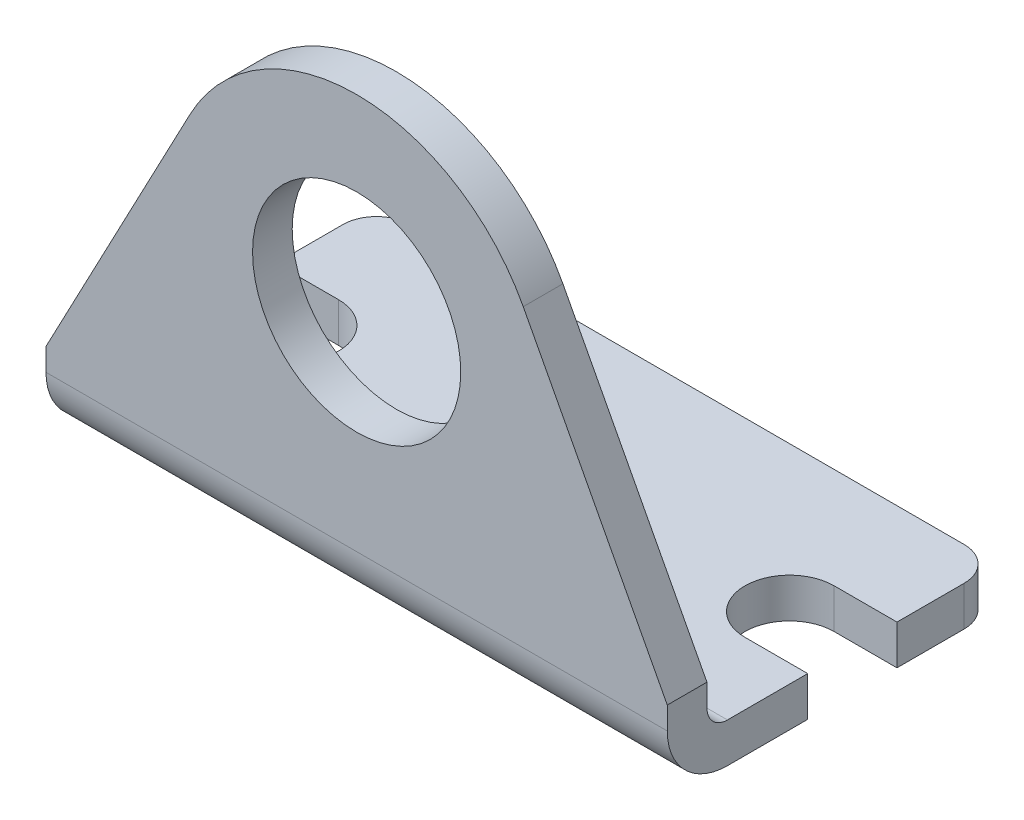
ISO-10303-21;
HEADER;
FILE_DESCRIPTION(('STEP AP214'),'2;1');
FILE_NAME('part.step','',(''),(''),'','','');
FILE_SCHEMA(('AUTOMOTIVE_DESIGN { 1 0 10303 214 1 1 1 1 }'));
ENDSEC;
DATA;
#1=APPLICATION_CONTEXT('core data for automotive mechanical design processes');
#2=APPLICATION_PROTOCOL_DEFINITION('international standard','automotive_design',2000,#1);
#3=PRODUCT_CONTEXT('',#1,'mechanical');
#4=PRODUCT('Part','Part','',(#3));
#5=PRODUCT_RELATED_PRODUCT_CATEGORY('part','',(#4));
#6=PRODUCT_DEFINITION_FORMATION('','',#4);
#7=PRODUCT_DEFINITION_CONTEXT('part definition',#1,'design');
#8=PRODUCT_DEFINITION('design','',#6,#7);
#9=PRODUCT_DEFINITION_SHAPE('','',#8);
#10=(LENGTH_UNIT() NAMED_UNIT(*) SI_UNIT(.MILLI.,.METRE.));
#11=(NAMED_UNIT(*) PLANE_ANGLE_UNIT() SI_UNIT($,.RADIAN.));
#12=(NAMED_UNIT(*) SI_UNIT($,.STERADIAN.) SOLID_ANGLE_UNIT());
#13=UNCERTAINTY_MEASURE_WITH_UNIT(LENGTH_MEASURE(1.E-05),#10,'distance_accuracy_value','');
#14=(GEOMETRIC_REPRESENTATION_CONTEXT(3) GLOBAL_UNCERTAINTY_ASSIGNED_CONTEXT((#13)) GLOBAL_UNIT_ASSIGNED_CONTEXT((#10,
#11,#12)) REPRESENTATION_CONTEXT('',''));
#15=CARTESIAN_POINT('',(0.,0.,0.));
#16=DIRECTION('',(0.,0.,1.));
#17=DIRECTION('',(1.,0.,0.));
#18=AXIS2_PLACEMENT_3D('',#15,#16,#17);
#19=CARTESIAN_POINT('',(-23.876,0.,-3.048));
#20=DIRECTION('',(-1.,0.,0.));
#21=DIRECTION('',(0.,0.,1.));
#22=AXIS2_PLACEMENT_3D('',#19,#20,#21);
#23=PLANE('',#22);
#24=DIRECTION('',(0.,0.,1.));
#25=VECTOR('',#24,1.);
#26=CARTESIAN_POINT('',(-23.876,0.,-3.048));
#27=LINE('',#26,#25);
#28=CARTESIAN_POINT('',(-23.876,0.,-10.795));
#29=VERTEX_POINT('',#28);
#30=CARTESIAN_POINT('',(-23.876,0.,-4.6228));
#31=VERTEX_POINT('',#30);
#32=EDGE_CURVE('E302',#29,#31,#27,.T.);
#33=ORIENTED_EDGE('',*,*,#32,.T.);
#34=CARTESIAN_POINT('',(-23.876,4.62279999999999,-4.6228));
#35=DIRECTION('',(-1.,0.,0.));
#36=DIRECTION('',(0.,0.,1.));
#37=AXIS2_PLACEMENT_3D('',#34,#35,#36);
#38=CIRCLE('',#37,4.6228);
#39=CARTESIAN_POINT('',(-23.876,4.62279999999999,0.));
#40=VERTEX_POINT('',#39);
#41=EDGE_CURVE('E11',#31,#40,#38,.T.);
#42=ORIENTED_EDGE('',*,*,#41,.T.);
#43=DIRECTION('',(0.,-1.,0.));
#44=VECTOR('',#43,1.);
#45=CARTESIAN_POINT('',(-23.876,0.,0.));
#46=LINE('',#45,#44);
#47=CARTESIAN_POINT('',(-23.876,6.35,0.));
#48=VERTEX_POINT('',#47);
#49=EDGE_CURVE('E285',#48,#40,#46,.T.);
#50=ORIENTED_EDGE('',*,*,#49,.F.);
#51=DIRECTION('',(0.,0.,1.));
#52=VECTOR('',#51,1.);
#53=CARTESIAN_POINT('',(-23.876,6.35,-3.048));
#54=LINE('',#53,#52);
#55=CARTESIAN_POINT('',(-23.876,6.35,-3.048));
#56=VERTEX_POINT('',#55);
#57=EDGE_CURVE('E315',#56,#48,#54,.T.);
#58=ORIENTED_EDGE('',*,*,#57,.F.);
#59=DIRECTION('',(0.,-1.,0.));
#60=VECTOR('',#59,1.);
#61=CARTESIAN_POINT('',(-23.876,0.,-3.048));
#62=LINE('',#61,#60);
#63=CARTESIAN_POINT('',(-23.876,4.6228,-3.048));
#64=VERTEX_POINT('',#63);
#65=EDGE_CURVE('E288',#56,#64,#62,.T.);
#66=ORIENTED_EDGE('',*,*,#65,.T.);
#67=CARTESIAN_POINT('',(-23.876,4.6228,-4.6228));
#68=DIRECTION('',(-1.,0.,0.));
#69=DIRECTION('',(0.,0.,1.));
#70=AXIS2_PLACEMENT_3D('',#67,#68,#69);
#71=CIRCLE('',#70,1.5748);
#72=CARTESIAN_POINT('',(-23.876,3.048,-4.6228));
#73=VERTEX_POINT('',#72);
#74=EDGE_CURVE('E177',#64,#73,#71,.F.);
#75=ORIENTED_EDGE('',*,*,#74,.T.);
#76=DIRECTION('',(0.,0.,-1.));
#77=VECTOR('',#76,1.);
#78=CARTESIAN_POINT('',(-23.876,3.048,-10.795));
#79=LINE('',#78,#77);
#80=CARTESIAN_POINT('',(-23.876,3.048,-10.795));
#81=VERTEX_POINT('',#80);
#82=EDGE_CURVE('E171',#73,#81,#79,.T.);
#83=ORIENTED_EDGE('',*,*,#82,.T.);
#84=DIRECTION('',(0.,-1.,0.));
#85=VECTOR('',#84,1.);
#86=CARTESIAN_POINT('',(-23.876,3.048,-10.795));
#87=LINE('',#86,#85);
#88=EDGE_CURVE('E173',#81,#29,#87,.T.);
#89=ORIENTED_EDGE('',*,*,#88,.T.);
#90=EDGE_LOOP('',(#33,#42,#50,#58,#66,#75,#83,#89));
#91=FACE_BOUND('',#90,.T.);
#92=ADVANCED_FACE('F36',(#91),#23,.T.);
#93=CARTESIAN_POINT('',(-23.876,6.35,-3.048));
#94=DIRECTION('',(-0.884416314502175,0.466698813628651,0.));
#95=DIRECTION('',(-0.466698813628651,-0.884416314502175,0.));
#96=AXIS2_PLACEMENT_3D('',#93,#94,#95);
#97=PLANE('',#96);
#98=DIRECTION('',(-0.466698813628651,-0.884416314502175,0.));
#99=VECTOR('',#98,1.);
#100=CARTESIAN_POINT('',(-23.876,6.35,0.));
#101=LINE('',#100,#99);
#102=CARTESIAN_POINT('',(-12.8045794013625,27.3308654237156,0.));
#103=VERTEX_POINT('',#102);
#104=EDGE_CURVE('E291',#103,#48,#101,.T.);
#105=ORIENTED_EDGE('',*,*,#104,.F.);
#106=DIRECTION('',(0.,0.,1.));
#107=VECTOR('',#106,1.);
#108=CARTESIAN_POINT('',(-12.8045794013625,27.3308654237156,-3.048));
#109=LINE('',#108,#107);
#110=CARTESIAN_POINT('',(-12.8045794013625,27.3308654237156,-3.048));
#111=VERTEX_POINT('',#110);
#112=EDGE_CURVE('E318',#111,#103,#109,.T.);
#113=ORIENTED_EDGE('',*,*,#112,.F.);
#114=DIRECTION('',(-0.466698813628651,-0.884416314502175,0.));
#115=VECTOR('',#114,1.);
#116=CARTESIAN_POINT('',(-23.876,6.35,-3.048));
#117=LINE('',#116,#115);
#118=EDGE_CURVE('E299',#111,#56,#117,.T.);
#119=ORIENTED_EDGE('',*,*,#118,.T.);
#120=ORIENTED_EDGE('',*,*,#57,.T.);
#121=EDGE_LOOP('',(#105,#113,#119,#120));
#122=FACE_BOUND('',#121,.T.);
#123=ADVANCED_FACE('F354',(#122),#97,.T.);
#124=CARTESIAN_POINT('',(0.,20.574,-3.048));
#125=DIRECTION('',(0.,0.,1.));
#126=DIRECTION('',(1.,0.,0.));
#127=AXIS2_PLACEMENT_3D('',#124,#125,#126);
#128=CYLINDRICAL_SURFACE('',#127,14.478);
#129=CARTESIAN_POINT('',(0.,20.574,0.));
#130=DIRECTION('',(0.,0.,1.));
#131=DIRECTION('',(-1.,0.,0.));
#132=AXIS2_PLACEMENT_3D('',#129,#130,#131);
#133=CIRCLE('',#132,14.478);
#134=CARTESIAN_POINT('',(12.8045794013625,27.3308654237156,0.));
#135=VERTEX_POINT('',#134);
#136=EDGE_CURVE('E310',#135,#103,#133,.T.);
#137=ORIENTED_EDGE('',*,*,#136,.F.);
#138=DIRECTION('',(0.,0.,1.));
#139=VECTOR('',#138,1.);
#140=CARTESIAN_POINT('',(12.8045794013625,27.3308654237156,-3.048));
#141=LINE('',#140,#139);
#142=CARTESIAN_POINT('',(12.8045794013625,27.3308654237156,-3.048));
#143=VERTEX_POINT('',#142);
#144=EDGE_CURVE('E320',#143,#135,#141,.T.);
#145=ORIENTED_EDGE('',*,*,#144,.F.);
#146=CARTESIAN_POINT('',(0.,20.574,-3.048));
#147=DIRECTION('',(0.,0.,1.));
#148=DIRECTION('',(-1.,0.,0.));
#149=AXIS2_PLACEMENT_3D('',#146,#147,#148);
#150=CIRCLE('',#149,14.478);
#151=EDGE_CURVE('E296',#143,#111,#150,.T.);
#152=ORIENTED_EDGE('',*,*,#151,.T.);
#153=ORIENTED_EDGE('',*,*,#112,.T.);
#154=EDGE_LOOP('',(#137,#145,#152,#153));
#155=FACE_BOUND('',#154,.T.);
#156=ADVANCED_FACE('F368',(#155),#128,.T.);
#157=CARTESIAN_POINT('',(12.8045794013625,27.3308654237156,-3.048));
#158=DIRECTION('',(0.884416314502175,0.466698813628651,0.));
#159=DIRECTION('',(-0.466698813628651,0.884416314502175,0.));
#160=AXIS2_PLACEMENT_3D('',#157,#158,#159);
#161=PLANE('',#160);
#162=DIRECTION('',(-0.466698813628651,0.884416314502175,0.));
#163=VECTOR('',#162,1.);
#164=CARTESIAN_POINT('',(12.8045794013625,27.3308654237156,0.));
#165=LINE('',#164,#163);
#166=CARTESIAN_POINT('',(23.876,6.35,0.));
#167=VERTEX_POINT('',#166);
#168=EDGE_CURVE('E307',#167,#135,#165,.T.);
#169=ORIENTED_EDGE('',*,*,#168,.F.);
#170=DIRECTION('',(0.,0.,1.));
#171=VECTOR('',#170,1.);
#172=CARTESIAN_POINT('',(23.876,6.35,-3.048));
#173=LINE('',#172,#171);
#174=CARTESIAN_POINT('',(23.876,6.35,-3.048));
#175=VERTEX_POINT('',#174);
#176=EDGE_CURVE('E322',#175,#167,#173,.T.);
#177=ORIENTED_EDGE('',*,*,#176,.F.);
#178=DIRECTION('',(-0.466698813628651,0.884416314502175,0.));
#179=VECTOR('',#178,1.);
#180=CARTESIAN_POINT('',(12.8045794013625,27.3308654237156,-3.048));
#181=LINE('',#180,#179);
#182=EDGE_CURVE('E293',#175,#143,#181,.T.);
#183=ORIENTED_EDGE('',*,*,#182,.T.);
#184=ORIENTED_EDGE('',*,*,#144,.T.);
#185=EDGE_LOOP('',(#169,#177,#183,#184));
#186=FACE_BOUND('',#185,.T.);
#187=ADVANCED_FACE('F349',(#186),#161,.T.);
#188=CARTESIAN_POINT('',(23.876,6.35,-3.048));
#189=DIRECTION('',(1.,0.,0.));
#190=DIRECTION('',(0.,0.,-1.));
#191=AXIS2_PLACEMENT_3D('',#188,#189,#190);
#192=PLANE('',#191);
#193=DIRECTION('',(0.,1.,0.));
#194=VECTOR('',#193,1.);
#195=CARTESIAN_POINT('',(23.876,6.35,0.));
#196=LINE('',#195,#194);
#197=CARTESIAN_POINT('',(23.876,4.62279999999999,0.));
#198=VERTEX_POINT('',#197);
#199=EDGE_CURVE('E305',#198,#167,#196,.T.);
#200=ORIENTED_EDGE('',*,*,#199,.F.);
#201=CARTESIAN_POINT('',(23.876,4.62279999999999,-4.6228));
#202=DIRECTION('',(1.,0.,0.));
#203=DIRECTION('',(0.,0.,-1.));
#204=AXIS2_PLACEMENT_3D('',#201,#202,#203);
#205=CIRCLE('',#204,4.6228);
#206=CARTESIAN_POINT('',(23.876,0.,-4.6228));
#207=VERTEX_POINT('',#206);
#208=EDGE_CURVE('E58',#198,#207,#205,.T.);
#209=ORIENTED_EDGE('',*,*,#208,.T.);
#210=DIRECTION('',(0.,0.,1.));
#211=VECTOR('',#210,1.);
#212=CARTESIAN_POINT('',(23.876,0.,-3.048));
#213=LINE('',#212,#211);
#214=CARTESIAN_POINT('',(23.876,0.,-10.795));
#215=VERTEX_POINT('',#214);
#216=EDGE_CURVE('E325',#215,#207,#213,.T.);
#217=ORIENTED_EDGE('',*,*,#216,.F.);
#218=DIRECTION('',(0.,-1.,0.));
#219=VECTOR('',#218,1.);
#220=CARTESIAN_POINT('',(23.876,3.048,-10.795));
#221=LINE('',#220,#219);
#222=CARTESIAN_POINT('',(23.876,3.048,-10.795));
#223=VERTEX_POINT('',#222);
#224=EDGE_CURVE('E259',#223,#215,#221,.T.);
#225=ORIENTED_EDGE('',*,*,#224,.F.);
#226=DIRECTION('',(0.,0.,1.));
#227=VECTOR('',#226,1.);
#228=CARTESIAN_POINT('',(23.876,3.048,-10.795));
#229=LINE('',#228,#227);
#230=CARTESIAN_POINT('',(23.876,3.048,-4.6228));
#231=VERTEX_POINT('',#230);
#232=EDGE_CURVE('E183',#223,#231,#229,.T.);
#233=ORIENTED_EDGE('',*,*,#232,.T.);
#234=CARTESIAN_POINT('',(23.876,4.6228,-4.6228));
#235=DIRECTION('',(1.,0.,0.));
#236=DIRECTION('',(0.,0.,-1.));
#237=AXIS2_PLACEMENT_3D('',#234,#235,#236);
#238=CIRCLE('',#237,1.5748);
#239=CARTESIAN_POINT('',(23.876,4.6228,-3.048));
#240=VERTEX_POINT('',#239);
#241=EDGE_CURVE('E331',#231,#240,#238,.F.);
#242=ORIENTED_EDGE('',*,*,#241,.T.);
#243=DIRECTION('',(0.,1.,0.));
#244=VECTOR('',#243,1.);
#245=CARTESIAN_POINT('',(23.876,6.35,-3.048));
#246=LINE('',#245,#244);
#247=EDGE_CURVE('E290',#240,#175,#246,.T.);
#248=ORIENTED_EDGE('',*,*,#247,.T.);
#249=ORIENTED_EDGE('',*,*,#176,.T.);
#250=EDGE_LOOP('',(#200,#209,#217,#225,#233,#242,#248,#249));
#251=FACE_BOUND('',#250,.T.);
#252=ADVANCED_FACE('F343',(#251),#192,.T.);
#253=CARTESIAN_POINT('',(23.876,0.,-3.048));
#254=DIRECTION('',(0.,-1.,0.));
#255=DIRECTION('',(0.,0.,-1.));
#256=AXIS2_PLACEMENT_3D('',#253,#254,#255);
#257=PLANE('',#256);
#258=ORIENTED_EDGE('',*,*,#216,.T.);
#259=DIRECTION('',(1.,0.,0.));
#260=VECTOR('',#259,1.);
#261=CARTESIAN_POINT('',(-23.876,0.,-4.6228));
#262=LINE('',#261,#260);
#263=EDGE_CURVE('E44',#207,#31,#262,.F.);
#264=ORIENTED_EDGE('',*,*,#263,.T.);
#265=ORIENTED_EDGE('',*,*,#32,.F.);
#266=DIRECTION('',(1.,0.,0.));
#267=VECTOR('',#266,1.);
#268=CARTESIAN_POINT('',(-19.05,0.,-10.795));
#269=LINE('',#268,#267);
#270=CARTESIAN_POINT('',(-19.05,0.,-10.795));
#271=VERTEX_POINT('',#270);
#272=EDGE_CURVE('E189',#29,#271,#269,.T.);
#273=ORIENTED_EDGE('',*,*,#272,.T.);
#274=CARTESIAN_POINT('',(-19.05,0.,-14.224));
#275=DIRECTION('',(0.,1.,0.));
#276=DIRECTION('',(0.,0.,1.));
#277=AXIS2_PLACEMENT_3D('',#274,#275,#276);
#278=CIRCLE('',#277,3.429);
#279=CARTESIAN_POINT('',(-19.05,0.,-17.653));
#280=VERTEX_POINT('',#279);
#281=EDGE_CURVE('E229',#271,#280,#278,.T.);
#282=ORIENTED_EDGE('',*,*,#281,.T.);
#283=DIRECTION('',(-1.,0.,0.));
#284=VECTOR('',#283,1.);
#285=CARTESIAN_POINT('',(-19.05,0.,-17.653));
#286=LINE('',#285,#284);
#287=CARTESIAN_POINT('',(-23.876,0.,-17.653));
#288=VERTEX_POINT('',#287);
#289=EDGE_CURVE('E232',#280,#288,#286,.T.);
#290=ORIENTED_EDGE('',*,*,#289,.T.);
#291=DIRECTION('',(0.,0.,-1.));
#292=VECTOR('',#291,1.);
#293=CARTESIAN_POINT('',(-23.876,0.,-22.8176666666667));
#294=LINE('',#293,#292);
#295=CARTESIAN_POINT('',(-23.876,0.,-22.8176666666667));
#296=VERTEX_POINT('',#295);
#297=EDGE_CURVE('E235',#288,#296,#294,.T.);
#298=ORIENTED_EDGE('',*,*,#297,.T.);
#299=CARTESIAN_POINT('',(-21.2936666666667,0.,-22.8176666666667));
#300=DIRECTION('',(0.,-1.,0.));
#301=DIRECTION('',(0.,0.,1.));
#302=AXIS2_PLACEMENT_3D('',#299,#300,#301);
#303=CIRCLE('',#302,2.58233333333334);
#304=CARTESIAN_POINT('',(-21.2936666666667,0.,-25.4));
#305=VERTEX_POINT('',#304);
#306=EDGE_CURVE('E238',#296,#305,#303,.T.);
#307=ORIENTED_EDGE('',*,*,#306,.T.);
#308=DIRECTION('',(1.,0.,0.));
#309=VECTOR('',#308,1.);
#310=CARTESIAN_POINT('',(-21.2936666666667,0.,-25.4));
#311=LINE('',#310,#309);
#312=CARTESIAN_POINT('',(21.2936666666667,0.,-25.4));
#313=VERTEX_POINT('',#312);
#314=EDGE_CURVE('E241',#305,#313,#311,.T.);
#315=ORIENTED_EDGE('',*,*,#314,.T.);
#316=CARTESIAN_POINT('',(21.2936666666667,0.,-22.8176666666667));
#317=DIRECTION('',(0.,-1.,0.));
#318=DIRECTION('',(0.,0.,-1.));
#319=AXIS2_PLACEMENT_3D('',#316,#317,#318);
#320=CIRCLE('',#319,2.58233333333334);
#321=CARTESIAN_POINT('',(23.876,0.,-22.8176666666667));
#322=VERTEX_POINT('',#321);
#323=EDGE_CURVE('E244',#313,#322,#320,.T.);
#324=ORIENTED_EDGE('',*,*,#323,.T.);
#325=DIRECTION('',(0.,0.,1.));
#326=VECTOR('',#325,1.);
#327=CARTESIAN_POINT('',(23.876,0.,-22.8176666666667));
#328=LINE('',#327,#326);
#329=CARTESIAN_POINT('',(23.876,0.,-17.653));
#330=VERTEX_POINT('',#329);
#331=EDGE_CURVE('E247',#322,#330,#328,.T.);
#332=ORIENTED_EDGE('',*,*,#331,.T.);
#333=DIRECTION('',(-1.,0.,0.));
#334=VECTOR('',#333,1.);
#335=CARTESIAN_POINT('',(23.876,0.,-17.653));
#336=LINE('',#335,#334);
#337=CARTESIAN_POINT('',(19.05,0.,-17.653));
#338=VERTEX_POINT('',#337);
#339=EDGE_CURVE('E250',#330,#338,#336,.T.);
#340=ORIENTED_EDGE('',*,*,#339,.T.);
#341=CARTESIAN_POINT('',(19.05,0.,-14.224));
#342=DIRECTION('',(0.,1.,0.));
#343=DIRECTION('',(0.,0.,-1.));
#344=AXIS2_PLACEMENT_3D('',#341,#342,#343);
#345=CIRCLE('',#344,3.429);
#346=CARTESIAN_POINT('',(19.05,0.,-10.795));
#347=VERTEX_POINT('',#346);
#348=EDGE_CURVE('E253',#338,#347,#345,.T.);
#349=ORIENTED_EDGE('',*,*,#348,.T.);
#350=DIRECTION('',(1.,0.,0.));
#351=VECTOR('',#350,1.);
#352=CARTESIAN_POINT('',(23.876,0.,-10.795));
#353=LINE('',#352,#351);
#354=EDGE_CURVE('E256',#347,#215,#353,.T.);
#355=ORIENTED_EDGE('',*,*,#354,.T.);
#356=EDGE_LOOP('',(#258,#264,#265,#273,#282,#290,#298,#307,#315,#324,#332,#340,#349,#355));
#357=FACE_BOUND('',#356,.T.);
#358=ADVANCED_FACE('F371',(#357),#257,.T.);
#359=CARTESIAN_POINT('',(0.,20.574,-3.048));
#360=DIRECTION('',(0.,0.,-1.));
#361=DIRECTION('',(-1.,0.,0.));
#362=AXIS2_PLACEMENT_3D('',#359,#360,#361);
#363=PLANE('',#362);
#364=ORIENTED_EDGE('',*,*,#247,.F.);
#365=DIRECTION('',(1.,0.,0.));
#366=VECTOR('',#365,1.);
#367=CARTESIAN_POINT('',(-23.876,4.6228,-3.048));
#368=LINE('',#367,#366);
#369=EDGE_CURVE('E329',#240,#64,#368,.F.);
#370=ORIENTED_EDGE('',*,*,#369,.T.);
#371=ORIENTED_EDGE('',*,*,#65,.F.);
#372=ORIENTED_EDGE('',*,*,#118,.F.);
#373=ORIENTED_EDGE('',*,*,#151,.F.);
#374=ORIENTED_EDGE('',*,*,#182,.F.);
#375=EDGE_LOOP('',(#364,#370,#371,#372,#373,#374));
#376=FACE_BOUND('',#375,.T.);
#377=CARTESIAN_POINT('',(0.,20.574,-3.048));
#378=DIRECTION('',(0.,0.,1.));
#379=DIRECTION('',(1.,0.,0.));
#380=AXIS2_PLACEMENT_3D('',#377,#378,#379);
#381=CIRCLE('',#380,8.001);
#382=CARTESIAN_POINT('',(8.001,20.574,-3.048));
#383=VERTEX_POINT('',#382);
#384=EDGE_CURVE('E282',#383,#383,#381,.T.);
#385=ORIENTED_EDGE('',*,*,#384,.T.);
#386=EDGE_LOOP('',(#385));
#387=FACE_BOUND('',#386,.T.);
#388=ADVANCED_FACE('F374',(#376,#387),#363,.T.);
#389=CARTESIAN_POINT('',(0.,20.574,0.));
#390=DIRECTION('',(0.,0.,-1.));
#391=DIRECTION('',(-1.,0.,0.));
#392=AXIS2_PLACEMENT_3D('',#389,#390,#391);
#393=PLANE('',#392);
#394=CARTESIAN_POINT('',(0.,20.574,0.));
#395=DIRECTION('',(0.,0.,1.));
#396=DIRECTION('',(1.,0.,0.));
#397=AXIS2_PLACEMENT_3D('',#394,#395,#396);
#398=CIRCLE('',#397,8.001);
#399=CARTESIAN_POINT('',(8.001,20.574,0.));
#400=VERTEX_POINT('',#399);
#401=EDGE_CURVE('E262',#400,#400,#398,.T.);
#402=ORIENTED_EDGE('',*,*,#401,.F.);
#403=EDGE_LOOP('',(#402));
#404=FACE_BOUND('',#403,.T.);
#405=ORIENTED_EDGE('',*,*,#49,.T.);
#406=DIRECTION('',(1.,0.,0.));
#407=VECTOR('',#406,1.);
#408=CARTESIAN_POINT('',(23.876,4.62279999999999,0.));
#409=LINE('',#408,#407);
#410=EDGE_CURVE('E334',#40,#198,#409,.T.);
#411=ORIENTED_EDGE('',*,*,#410,.T.);
#412=ORIENTED_EDGE('',*,*,#199,.T.);
#413=ORIENTED_EDGE('',*,*,#168,.T.);
#414=ORIENTED_EDGE('',*,*,#136,.T.);
#415=ORIENTED_EDGE('',*,*,#104,.T.);
#416=EDGE_LOOP('',(#405,#411,#412,#413,#414,#415));
#417=FACE_BOUND('',#416,.T.);
#418=ADVANCED_FACE('F339',(#404,#417),#393,.F.);
#419=CARTESIAN_POINT('',(0.,20.574,-3.048));
#420=DIRECTION('',(0.,0.,1.));
#421=DIRECTION('',(1.,0.,0.));
#422=AXIS2_PLACEMENT_3D('',#419,#420,#421);
#423=CYLINDRICAL_SURFACE('',#422,8.001);
#424=CARTESIAN_POINT('',(8.001,20.574,-3.048));
#425=CARTESIAN_POINT('',(8.001,20.574,-3.01625));
#426=CARTESIAN_POINT('',(8.001,20.574,-2.9845));
#427=CARTESIAN_POINT('',(8.001,20.574,-2.921));
#428=CARTESIAN_POINT('',(8.001,20.574,-2.88925));
#429=CARTESIAN_POINT('',(8.001,20.574,-2.82575));
#430=CARTESIAN_POINT('',(8.001,20.574,-2.794));
#431=CARTESIAN_POINT('',(8.001,20.574,-2.7305));
#432=CARTESIAN_POINT('',(8.001,20.574,-2.69875));
#433=CARTESIAN_POINT('',(8.001,20.574,-2.63525));
#434=CARTESIAN_POINT('',(8.001,20.574,-2.6035));
#435=CARTESIAN_POINT('',(8.001,20.574,-2.54));
#436=CARTESIAN_POINT('',(8.001,20.574,-2.50825));
#437=CARTESIAN_POINT('',(8.001,20.574,-2.44475));
#438=CARTESIAN_POINT('',(8.001,20.574,-2.413));
#439=CARTESIAN_POINT('',(8.001,20.574,-2.3495));
#440=CARTESIAN_POINT('',(8.001,20.574,-2.31775));
#441=CARTESIAN_POINT('',(8.001,20.574,-2.25425));
#442=CARTESIAN_POINT('',(8.001,20.574,-2.2225));
#443=CARTESIAN_POINT('',(8.001,20.574,-2.159));
#444=CARTESIAN_POINT('',(8.001,20.574,-2.12725));
#445=CARTESIAN_POINT('',(8.001,20.574,-2.06375));
#446=CARTESIAN_POINT('',(8.001,20.574,-2.032));
#447=CARTESIAN_POINT('',(8.001,20.574,-1.9685));
#448=CARTESIAN_POINT('',(8.001,20.574,-1.93675));
#449=CARTESIAN_POINT('',(8.001,20.574,-1.87325));
#450=CARTESIAN_POINT('',(8.001,20.574,-1.8415));
#451=CARTESIAN_POINT('',(8.001,20.574,-1.778));
#452=CARTESIAN_POINT('',(8.001,20.574,-1.74625));
#453=CARTESIAN_POINT('',(8.001,20.574,-1.68275));
#454=CARTESIAN_POINT('',(8.001,20.574,-1.651));
#455=CARTESIAN_POINT('',(8.001,20.574,-1.5875));
#456=CARTESIAN_POINT('',(8.001,20.574,-1.55575));
#457=CARTESIAN_POINT('',(8.001,20.574,-1.49225));
#458=CARTESIAN_POINT('',(8.001,20.574,-1.4605));
#459=CARTESIAN_POINT('',(8.001,20.574,-1.397));
#460=CARTESIAN_POINT('',(8.001,20.574,-1.36525));
#461=CARTESIAN_POINT('',(8.001,20.574,-1.30175));
#462=CARTESIAN_POINT('',(8.001,20.574,-1.27));
#463=CARTESIAN_POINT('',(8.001,20.574,-1.2065));
#464=CARTESIAN_POINT('',(8.001,20.574,-1.17475));
#465=CARTESIAN_POINT('',(8.001,20.574,-1.11125));
#466=CARTESIAN_POINT('',(8.001,20.574,-1.0795));
#467=CARTESIAN_POINT('',(8.001,20.574,-1.016));
#468=CARTESIAN_POINT('',(8.001,20.574,-0.98425));
#469=CARTESIAN_POINT('',(8.001,20.574,-0.92075));
#470=CARTESIAN_POINT('',(8.001,20.574,-0.889));
#471=CARTESIAN_POINT('',(8.001,20.574,-0.8255));
#472=CARTESIAN_POINT('',(8.001,20.574,-0.79375));
#473=CARTESIAN_POINT('',(8.001,20.574,-0.73025));
#474=CARTESIAN_POINT('',(8.001,20.574,-0.6985));
#475=CARTESIAN_POINT('',(8.001,20.574,-0.635));
#476=CARTESIAN_POINT('',(8.001,20.574,-0.60325));
#477=CARTESIAN_POINT('',(8.001,20.574,-0.53975));
#478=CARTESIAN_POINT('',(8.001,20.574,-0.508));
#479=CARTESIAN_POINT('',(8.001,20.574,-0.4445));
#480=CARTESIAN_POINT('',(8.001,20.574,-0.41275));
#481=CARTESIAN_POINT('',(8.001,20.574,-0.34925));
#482=CARTESIAN_POINT('',(8.001,20.574,-0.3175));
#483=CARTESIAN_POINT('',(8.001,20.574,-0.254));
#484=CARTESIAN_POINT('',(8.001,20.574,-0.22225));
#485=CARTESIAN_POINT('',(8.001,20.574,-0.15875));
#486=CARTESIAN_POINT('',(8.001,20.574,-0.127));
#487=CARTESIAN_POINT('',(8.001,20.574,-0.0634999999999999));
#488=CARTESIAN_POINT('',(8.001,20.574,-0.03175));
#489=CARTESIAN_POINT('',(8.001,20.574,0.));
#490=B_SPLINE_CURVE_WITH_KNOTS('',3,(#424,#425,#426,#427,#428,#429,#430,#431,#432,#433,#434,
#435,#436,#437,#438,#439,#440,#441,#442,#443,#444,#445,#446,#447,#448,#449,#450,#451,#452,#453,
#454,#455,#456,#457,#458,#459,#460,#461,#462,#463,#464,#465,#466,#467,#468,#469,#470,#471,#472,
#473,#474,#475,#476,#477,#478,#479,#480,#481,#482,#483,#484,#485,#486,#487,#488,#489),
.UNSPECIFIED.,.F.,.F.,(4,2,2,2,2,2,2,2,2,2,2,2,2,2,2,2,2,2,2,2,2,2,2,2,2,2,2,2,2,2,2,2,4),(0.,
0.0952500000000003,0.1905,0.28575,0.381,0.47625,0.5715,0.66675,0.762000000000001,0.85725,0.9525,
1.04775,1.143,1.23825,1.3335,1.42875,1.524,1.61925,1.7145,1.80975,1.905,2.00025,2.0955,2.19075,
2.286,2.38125,2.4765,2.57175,2.667,2.76225,2.8575,2.95275,3.048),.UNSPECIFIED.);
#491=EDGE_CURVE('BSEAM383',#383,#400,#490,.T.);
#492=ORIENTED_EDGE('',*,*,#384,.F.);
#493=ORIENTED_EDGE('',*,*,#401,.T.);
#494=ORIENTED_EDGE('',*,*,#491,.T.);
#495=ORIENTED_EDGE('',*,*,#491,.F.);
#496=EDGE_LOOP('',(#492,#494,#493,#495));
#497=FACE_BOUND('',#496,.T.);
#498=ADVANCED_FACE('F383',(#497),#423,.F.);
#499=CARTESIAN_POINT('',(23.876,3.048,-10.795));
#500=DIRECTION('',(0.,0.,-1.));
#501=DIRECTION('',(-1.,0.,0.));
#502=AXIS2_PLACEMENT_3D('',#499,#500,#501);
#503=PLANE('',#502);
#504=ORIENTED_EDGE('',*,*,#354,.F.);
#505=DIRECTION('',(0.,-1.,0.));
#506=VECTOR('',#505,1.);
#507=CARTESIAN_POINT('',(19.05,3.048,-10.795));
#508=LINE('',#507,#506);
#509=CARTESIAN_POINT('',(19.05,3.048,-10.795));
#510=VERTEX_POINT('',#509);
#511=EDGE_CURVE('E263',#510,#347,#508,.T.);
#512=ORIENTED_EDGE('',*,*,#511,.F.);
#513=DIRECTION('',(1.,0.,0.));
#514=VECTOR('',#513,1.);
#515=CARTESIAN_POINT('',(23.876,3.048,-10.795));
#516=LINE('',#515,#514);
#517=EDGE_CURVE('E191',#510,#223,#516,.T.);
#518=ORIENTED_EDGE('',*,*,#517,.T.);
#519=ORIENTED_EDGE('',*,*,#224,.T.);
#520=EDGE_LOOP('',(#504,#512,#518,#519));
#521=FACE_BOUND('',#520,.T.);
#522=ADVANCED_FACE('F390',(#521),#503,.T.);
#523=CARTESIAN_POINT('',(19.05,3.048,-14.224));
#524=DIRECTION('',(0.,-1.,0.));
#525=DIRECTION('',(0.,0.,-1.));
#526=AXIS2_PLACEMENT_3D('',#523,#524,#525);
#527=CYLINDRICAL_SURFACE('',#526,3.429);
#528=ORIENTED_EDGE('',*,*,#348,.F.);
#529=DIRECTION('',(0.,-1.,0.));
#530=VECTOR('',#529,1.);
#531=CARTESIAN_POINT('',(19.05,3.048,-17.653));
#532=LINE('',#531,#530);
#533=CARTESIAN_POINT('',(19.05,3.048,-17.653));
#534=VERTEX_POINT('',#533);
#535=EDGE_CURVE('E265',#534,#338,#532,.T.);
#536=ORIENTED_EDGE('',*,*,#535,.F.);
#537=CARTESIAN_POINT('',(19.05,3.048,-14.224));
#538=DIRECTION('',(0.,1.,0.));
#539=DIRECTION('',(0.,0.,-1.));
#540=AXIS2_PLACEMENT_3D('',#537,#538,#539);
#541=CIRCLE('',#540,3.429);
#542=EDGE_CURVE('E223',#534,#510,#541,.T.);
#543=ORIENTED_EDGE('',*,*,#542,.T.);
#544=ORIENTED_EDGE('',*,*,#511,.T.);
#545=EDGE_LOOP('',(#528,#536,#543,#544));
#546=FACE_BOUND('',#545,.T.);
#547=ADVANCED_FACE('F425',(#546),#527,.F.);
#548=CARTESIAN_POINT('',(23.876,3.048,-17.653));
#549=DIRECTION('',(0.,0.,1.));
#550=DIRECTION('',(1.,0.,0.));
#551=AXIS2_PLACEMENT_3D('',#548,#549,#550);
#552=PLANE('',#551);
#553=ORIENTED_EDGE('',*,*,#339,.F.);
#554=DIRECTION('',(0.,-1.,0.));
#555=VECTOR('',#554,1.);
#556=CARTESIAN_POINT('',(23.876,3.048,-17.653));
#557=LINE('',#556,#555);
#558=CARTESIAN_POINT('',(23.876,3.048,-17.653));
#559=VERTEX_POINT('',#558);
#560=EDGE_CURVE('E267',#559,#330,#557,.T.);
#561=ORIENTED_EDGE('',*,*,#560,.F.);
#562=DIRECTION('',(-1.,0.,0.));
#563=VECTOR('',#562,1.);
#564=CARTESIAN_POINT('',(23.876,3.048,-17.653));
#565=LINE('',#564,#563);
#566=EDGE_CURVE('E220',#559,#534,#565,.T.);
#567=ORIENTED_EDGE('',*,*,#566,.T.);
#568=ORIENTED_EDGE('',*,*,#535,.T.);
#569=EDGE_LOOP('',(#553,#561,#567,#568));
#570=FACE_BOUND('',#569,.T.);
#571=ADVANCED_FACE('F421',(#570),#552,.T.);
#572=CARTESIAN_POINT('',(23.876,3.048,-22.8176666666667));
#573=DIRECTION('',(1.,0.,0.));
#574=DIRECTION('',(0.,0.,-1.));
#575=AXIS2_PLACEMENT_3D('',#572,#573,#574);
#576=PLANE('',#575);
#577=ORIENTED_EDGE('',*,*,#331,.F.);
#578=DIRECTION('',(0.,-1.,0.));
#579=VECTOR('',#578,1.);
#580=CARTESIAN_POINT('',(23.876,3.048,-22.8176666666667));
#581=LINE('',#580,#579);
#582=CARTESIAN_POINT('',(23.876,3.048,-22.8176666666667));
#583=VERTEX_POINT('',#582);
#584=EDGE_CURVE('E269',#583,#322,#581,.T.);
#585=ORIENTED_EDGE('',*,*,#584,.F.);
#586=DIRECTION('',(0.,0.,1.));
#587=VECTOR('',#586,1.);
#588=CARTESIAN_POINT('',(23.876,3.048,-22.8176666666667));
#589=LINE('',#588,#587);
#590=EDGE_CURVE('E217',#583,#559,#589,.T.);
#591=ORIENTED_EDGE('',*,*,#590,.T.);
#592=ORIENTED_EDGE('',*,*,#560,.T.);
#593=EDGE_LOOP('',(#577,#585,#591,#592));
#594=FACE_BOUND('',#593,.T.);
#595=ADVANCED_FACE('F417',(#594),#576,.T.);
#596=CARTESIAN_POINT('',(21.2936666666667,3.048,-22.8176666666667));
#597=DIRECTION('',(0.,-1.,0.));
#598=DIRECTION('',(0.,0.,-1.));
#599=AXIS2_PLACEMENT_3D('',#596,#597,#598);
#600=CYLINDRICAL_SURFACE('',#599,2.58233333333334);
#601=ORIENTED_EDGE('',*,*,#323,.F.);
#602=DIRECTION('',(0.,-1.,0.));
#603=VECTOR('',#602,1.);
#604=CARTESIAN_POINT('',(21.2936666666667,3.048,-25.4));
#605=LINE('',#604,#603);
#606=CARTESIAN_POINT('',(21.2936666666667,3.048,-25.4));
#607=VERTEX_POINT('',#606);
#608=EDGE_CURVE('E271',#607,#313,#605,.T.);
#609=ORIENTED_EDGE('',*,*,#608,.F.);
#610=CARTESIAN_POINT('',(21.2936666666667,3.048,-22.8176666666667));
#611=DIRECTION('',(0.,-1.,0.));
#612=DIRECTION('',(0.,0.,-1.));
#613=AXIS2_PLACEMENT_3D('',#610,#611,#612);
#614=CIRCLE('',#613,2.58233333333334);
#615=EDGE_CURVE('E214',#607,#583,#614,.T.);
#616=ORIENTED_EDGE('',*,*,#615,.T.);
#617=ORIENTED_EDGE('',*,*,#584,.T.);
#618=EDGE_LOOP('',(#601,#609,#616,#617));
#619=FACE_BOUND('',#618,.T.);
#620=ADVANCED_FACE('F413',(#619),#600,.T.);
#621=CARTESIAN_POINT('',(-21.2936666666667,3.048,-25.4));
#622=DIRECTION('',(0.,0.,-1.));
#623=DIRECTION('',(-1.,0.,0.));
#624=AXIS2_PLACEMENT_3D('',#621,#622,#623);
#625=PLANE('',#624);
#626=ORIENTED_EDGE('',*,*,#314,.F.);
#627=DIRECTION('',(0.,-1.,0.));
#628=VECTOR('',#627,1.);
#629=CARTESIAN_POINT('',(-21.2936666666667,3.048,-25.4));
#630=LINE('',#629,#628);
#631=CARTESIAN_POINT('',(-21.2936666666667,3.048,-25.4));
#632=VERTEX_POINT('',#631);
#633=EDGE_CURVE('E273',#632,#305,#630,.T.);
#634=ORIENTED_EDGE('',*,*,#633,.F.);
#635=DIRECTION('',(1.,0.,0.));
#636=VECTOR('',#635,1.);
#637=CARTESIAN_POINT('',(-21.2936666666667,3.048,-25.4));
#638=LINE('',#637,#636);
#639=EDGE_CURVE('E211',#632,#607,#638,.T.);
#640=ORIENTED_EDGE('',*,*,#639,.T.);
#641=ORIENTED_EDGE('',*,*,#608,.T.);
#642=EDGE_LOOP('',(#626,#634,#640,#641));
#643=FACE_BOUND('',#642,.T.);
#644=ADVANCED_FACE('F409',(#643),#625,.T.);
#645=CARTESIAN_POINT('',(-21.2936666666667,3.048,-22.8176666666667));
#646=DIRECTION('',(0.,-1.,0.));
#647=DIRECTION('',(0.,0.,-1.));
#648=AXIS2_PLACEMENT_3D('',#645,#646,#647);
#649=CYLINDRICAL_SURFACE('',#648,2.58233333333334);
#650=ORIENTED_EDGE('',*,*,#306,.F.);
#651=DIRECTION('',(0.,-1.,0.));
#652=VECTOR('',#651,1.);
#653=CARTESIAN_POINT('',(-23.876,3.048,-22.8176666666667));
#654=LINE('',#653,#652);
#655=CARTESIAN_POINT('',(-23.876,3.048,-22.8176666666667));
#656=VERTEX_POINT('',#655);
#657=EDGE_CURVE('E275',#656,#296,#654,.T.);
#658=ORIENTED_EDGE('',*,*,#657,.F.);
#659=CARTESIAN_POINT('',(-21.2936666666667,3.048,-22.8176666666667));
#660=DIRECTION('',(0.,-1.,0.));
#661=DIRECTION('',(0.,0.,1.));
#662=AXIS2_PLACEMENT_3D('',#659,#660,#661);
#663=CIRCLE('',#662,2.58233333333334);
#664=EDGE_CURVE('E208',#656,#632,#663,.T.);
#665=ORIENTED_EDGE('',*,*,#664,.T.);
#666=ORIENTED_EDGE('',*,*,#633,.T.);
#667=EDGE_LOOP('',(#650,#658,#665,#666));
#668=FACE_BOUND('',#667,.T.);
#669=ADVANCED_FACE('F405',(#668),#649,.T.);
#670=CARTESIAN_POINT('',(-23.876,3.048,-22.8176666666667));
#671=DIRECTION('',(-1.,0.,0.));
#672=DIRECTION('',(0.,0.,1.));
#673=AXIS2_PLACEMENT_3D('',#670,#671,#672);
#674=PLANE('',#673);
#675=ORIENTED_EDGE('',*,*,#297,.F.);
#676=DIRECTION('',(0.,-1.,0.));
#677=VECTOR('',#676,1.);
#678=CARTESIAN_POINT('',(-23.876,3.048,-17.653));
#679=LINE('',#678,#677);
#680=CARTESIAN_POINT('',(-23.876,3.048,-17.653));
#681=VERTEX_POINT('',#680);
#682=EDGE_CURVE('E277',#681,#288,#679,.T.);
#683=ORIENTED_EDGE('',*,*,#682,.F.);
#684=DIRECTION('',(0.,0.,-1.));
#685=VECTOR('',#684,1.);
#686=CARTESIAN_POINT('',(-23.876,3.048,-22.8176666666667));
#687=LINE('',#686,#685);
#688=EDGE_CURVE('E205',#681,#656,#687,.T.);
#689=ORIENTED_EDGE('',*,*,#688,.T.);
#690=ORIENTED_EDGE('',*,*,#657,.T.);
#691=EDGE_LOOP('',(#675,#683,#689,#690));
#692=FACE_BOUND('',#691,.T.);
#693=ADVANCED_FACE('F401',(#692),#674,.T.);
#694=CARTESIAN_POINT('',(-19.05,3.048,-17.653));
#695=DIRECTION('',(0.,0.,1.));
#696=DIRECTION('',(1.,0.,0.));
#697=AXIS2_PLACEMENT_3D('',#694,#695,#696);
#698=PLANE('',#697);
#699=ORIENTED_EDGE('',*,*,#289,.F.);
#700=DIRECTION('',(0.,-1.,0.));
#701=VECTOR('',#700,1.);
#702=CARTESIAN_POINT('',(-19.05,3.048,-17.653));
#703=LINE('',#702,#701);
#704=CARTESIAN_POINT('',(-19.05,3.048,-17.653));
#705=VERTEX_POINT('',#704);
#706=EDGE_CURVE('E279',#705,#280,#703,.T.);
#707=ORIENTED_EDGE('',*,*,#706,.F.);
#708=DIRECTION('',(-1.,0.,0.));
#709=VECTOR('',#708,1.);
#710=CARTESIAN_POINT('',(-19.05,3.048,-17.653));
#711=LINE('',#710,#709);
#712=EDGE_CURVE('E199',#705,#681,#711,.T.);
#713=ORIENTED_EDGE('',*,*,#712,.T.);
#714=ORIENTED_EDGE('',*,*,#682,.T.);
#715=EDGE_LOOP('',(#699,#707,#713,#714));
#716=FACE_BOUND('',#715,.T.);
#717=ADVANCED_FACE('F397',(#716),#698,.T.);
#718=CARTESIAN_POINT('',(-19.05,3.048,-14.224));
#719=DIRECTION('',(0.,-1.,0.));
#720=DIRECTION('',(0.,0.,-1.));
#721=AXIS2_PLACEMENT_3D('',#718,#719,#720);
#722=CYLINDRICAL_SURFACE('',#721,3.429);
#723=ORIENTED_EDGE('',*,*,#281,.F.);
#724=DIRECTION('',(0.,-1.,0.));
#725=VECTOR('',#724,1.);
#726=CARTESIAN_POINT('',(-19.05,3.048,-10.795));
#727=LINE('',#726,#725);
#728=CARTESIAN_POINT('',(-19.05,3.048,-10.795));
#729=VERTEX_POINT('',#728);
#730=EDGE_CURVE('E190',#729,#271,#727,.T.);
#731=ORIENTED_EDGE('',*,*,#730,.F.);
#732=CARTESIAN_POINT('',(-19.05,3.048,-14.224));
#733=DIRECTION('',(0.,1.,0.));
#734=DIRECTION('',(0.,0.,1.));
#735=AXIS2_PLACEMENT_3D('',#732,#733,#734);
#736=CIRCLE('',#735,3.429);
#737=EDGE_CURVE('E197',#729,#705,#736,.T.);
#738=ORIENTED_EDGE('',*,*,#737,.T.);
#739=ORIENTED_EDGE('',*,*,#706,.T.);
#740=EDGE_LOOP('',(#723,#731,#738,#739));
#741=FACE_BOUND('',#740,.T.);
#742=ADVANCED_FACE('F394',(#741),#722,.F.);
#743=CARTESIAN_POINT('',(-19.05,3.048,-10.795));
#744=DIRECTION('',(0.,0.,-1.));
#745=DIRECTION('',(-1.,0.,0.));
#746=AXIS2_PLACEMENT_3D('',#743,#744,#745);
#747=PLANE('',#746);
#748=ORIENTED_EDGE('',*,*,#272,.F.);
#749=ORIENTED_EDGE('',*,*,#88,.F.);
#750=DIRECTION('',(1.,0.,0.));
#751=VECTOR('',#750,1.);
#752=CARTESIAN_POINT('',(-19.05,3.048,-10.795));
#753=LINE('',#752,#751);
#754=EDGE_CURVE('E182',#81,#729,#753,.T.);
#755=ORIENTED_EDGE('',*,*,#754,.T.);
#756=ORIENTED_EDGE('',*,*,#730,.T.);
#757=EDGE_LOOP('',(#748,#749,#755,#756));
#758=FACE_BOUND('',#757,.T.);
#759=ADVANCED_FACE('F187',(#758),#747,.T.);
#760=CARTESIAN_POINT('',(-19.05,3.048,-14.224));
#761=DIRECTION('',(0.,1.,0.));
#762=DIRECTION('',(0.,0.,1.));
#763=AXIS2_PLACEMENT_3D('',#760,#761,#762);
#764=PLANE('',#763);
#765=ORIENTED_EDGE('',*,*,#82,.F.);
#766=DIRECTION('',(1.,0.,0.));
#767=VECTOR('',#766,1.);
#768=CARTESIAN_POINT('',(23.876,3.048,-4.6228));
#769=LINE('',#768,#767);
#770=EDGE_CURVE('E317',#73,#231,#769,.T.);
#771=ORIENTED_EDGE('',*,*,#770,.T.);
#772=ORIENTED_EDGE('',*,*,#232,.F.);
#773=ORIENTED_EDGE('',*,*,#517,.F.);
#774=ORIENTED_EDGE('',*,*,#542,.F.);
#775=ORIENTED_EDGE('',*,*,#566,.F.);
#776=ORIENTED_EDGE('',*,*,#590,.F.);
#777=ORIENTED_EDGE('',*,*,#615,.F.);
#778=ORIENTED_EDGE('',*,*,#639,.F.);
#779=ORIENTED_EDGE('',*,*,#664,.F.);
#780=ORIENTED_EDGE('',*,*,#688,.F.);
#781=ORIENTED_EDGE('',*,*,#712,.F.);
#782=ORIENTED_EDGE('',*,*,#737,.F.);
#783=ORIENTED_EDGE('',*,*,#754,.F.);
#784=EDGE_LOOP('',(#765,#771,#772,#773,#774,#775,#776,#777,#778,#779,#780,#781,#782,#783));
#785=FACE_BOUND('',#784,.T.);
#786=ADVANCED_FACE('F194',(#785),#764,.T.);
#787=CARTESIAN_POINT('',(-19.05,4.6228,-4.6228));
#788=DIRECTION('',(-1.,0.,0.));
#789=DIRECTION('',(0.,0.,1.));
#790=AXIS2_PLACEMENT_3D('',#787,#788,#789);
#791=CYLINDRICAL_SURFACE('',#790,1.5748);
#792=ORIENTED_EDGE('',*,*,#74,.F.);
#793=ORIENTED_EDGE('',*,*,#369,.F.);
#794=ORIENTED_EDGE('',*,*,#241,.F.);
#795=ORIENTED_EDGE('',*,*,#770,.F.);
#796=EDGE_LOOP('',(#792,#793,#794,#795));
#797=FACE_BOUND('',#796,.T.);
#798=ADVANCED_FACE('F358',(#797),#791,.F.);
#799=CARTESIAN_POINT('',(0.,4.62279999999999,-4.6228));
#800=DIRECTION('',(-1.,0.,0.));
#801=DIRECTION('',(0.,0.,1.));
#802=AXIS2_PLACEMENT_3D('',#799,#800,#801);
#803=CYLINDRICAL_SURFACE('',#802,4.6228);
#804=ORIENTED_EDGE('',*,*,#41,.F.);
#805=ORIENTED_EDGE('',*,*,#263,.F.);
#806=ORIENTED_EDGE('',*,*,#208,.F.);
#807=ORIENTED_EDGE('',*,*,#410,.F.);
#808=EDGE_LOOP('',(#804,#805,#806,#807));
#809=FACE_BOUND('',#808,.T.);
#810=ADVANCED_FACE('F38',(#809),#803,.T.);
#811=CLOSED_SHELL('',(#92,#123,#156,#187,#252,#358,#388,#418,#498,#522,#547,#571,#595,#620,#644,
#669,#693,#717,#742,#759,#786,#798,#810));
#812=MANIFOLD_SOLID_BREP('B2',#811);
#813=ADVANCED_BREP_SHAPE_REPRESENTATION('',(#18,#812),#14);
#814=SHAPE_DEFINITION_REPRESENTATION(#9,#813);
ENDSEC;
END-ISO-10303-21;
